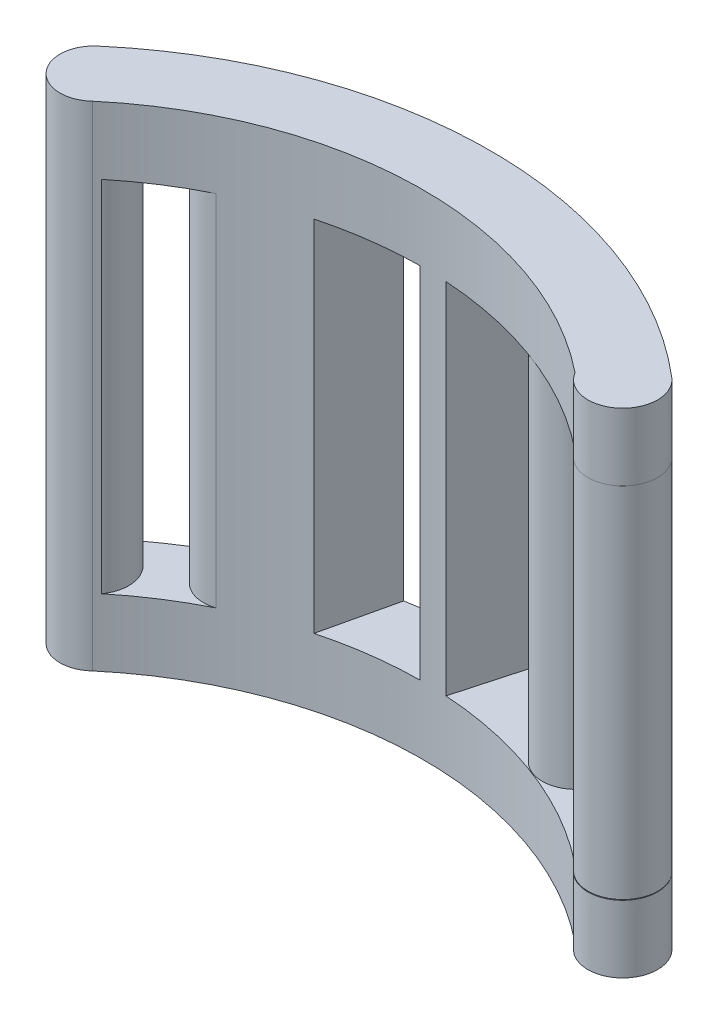
ISO-10303-21;
HEADER;
FILE_DESCRIPTION(('STEP AP214'),'2;1');
FILE_NAME('part.step','',(''),(''),'','','');
FILE_SCHEMA(('AUTOMOTIVE_DESIGN { 1 0 10303 214 1 1 1 1 }'));
ENDSEC;
DATA;
#1=APPLICATION_CONTEXT('core data for automotive mechanical design processes');
#2=APPLICATION_PROTOCOL_DEFINITION('international standard','automotive_design',2000,#1);
#3=PRODUCT_CONTEXT('',#1,'mechanical');
#4=PRODUCT('Part','Part','',(#3));
#5=PRODUCT_RELATED_PRODUCT_CATEGORY('part','',(#4));
#6=PRODUCT_DEFINITION_FORMATION('','',#4);
#7=PRODUCT_DEFINITION_CONTEXT('part definition',#1,'design');
#8=PRODUCT_DEFINITION('design','',#6,#7);
#9=PRODUCT_DEFINITION_SHAPE('','',#8);
#10=(LENGTH_UNIT() NAMED_UNIT(*) SI_UNIT(.MILLI.,.METRE.));
#11=(NAMED_UNIT(*) PLANE_ANGLE_UNIT() SI_UNIT($,.RADIAN.));
#12=(NAMED_UNIT(*) SI_UNIT($,.STERADIAN.) SOLID_ANGLE_UNIT());
#13=UNCERTAINTY_MEASURE_WITH_UNIT(LENGTH_MEASURE(1.E-05),#10,'distance_accuracy_value','');
#14=(GEOMETRIC_REPRESENTATION_CONTEXT(3) GLOBAL_UNCERTAINTY_ASSIGNED_CONTEXT((#13)) GLOBAL_UNIT_ASSIGNED_CONTEXT((#10,
#11,#12)) REPRESENTATION_CONTEXT('',''));
#15=CARTESIAN_POINT('',(0.,0.,0.));
#16=DIRECTION('',(0.,0.,1.));
#17=DIRECTION('',(1.,0.,0.));
#18=AXIS2_PLACEMENT_3D('',#15,#16,#17);
#19=CARTESIAN_POINT('',(0.,7.5,0.));
#20=DIRECTION('',(0.,1.,0.));
#21=DIRECTION('',(0.,0.,1.));
#22=AXIS2_PLACEMENT_3D('',#19,#20,#21);
#23=PLANE('',#22);
#24=CARTESIAN_POINT('',(0.,7.5,37.5));
#25=DIRECTION('',(0.,1.,0.));
#26=DIRECTION('',(0.,0.,1.));
#27=AXIS2_PLACEMENT_3D('',#24,#25,#26);
#28=CIRCLE('',#27,41.7666594256334);
#29=CARTESIAN_POINT('',(-26.40696401353,7.5,5.14067226957616));
#30=VERTEX_POINT('',#29);
#31=CARTESIAN_POINT('',(-18.6730291575454,7.5,0.139970266897417));
#32=VERTEX_POINT('',#31);
#33=EDGE_CURVE('E306',#30,#32,#28,.F.);
#34=ORIENTED_EDGE('',*,*,#33,.T.);
#35=CARTESIAN_POINT('',(-19.8727473270932,7.5,-3.46567479517633));
#36=DIRECTION('',(0.,1.,0.));
#37=DIRECTION('',(0.,0.,1.));
#38=AXIS2_PLACEMENT_3D('',#35,#36,#37);
#39=CIRCLE('',#38,3.8);
#40=CARTESIAN_POINT('',(-21.989278078504,7.5,-6.62166870808745));
#41=VERTEX_POINT('',#40);
#42=EDGE_CURVE('E50',#41,#32,#39,.T.);
#43=ORIENTED_EDGE('',*,*,#42,.F.);
#44=CARTESIAN_POINT('',(0.,7.5,37.5));
#45=DIRECTION('',(0.,1.,0.));
#46=DIRECTION('',(0.,0.,1.));
#47=AXIS2_PLACEMENT_3D('',#44,#45,#46);
#48=CIRCLE('',#47,49.2975658628294);
#49=CARTESIAN_POINT('',(-31.2499618410222,7.5,-0.62728530769867));
#50=VERTEX_POINT('',#49);
#51=EDGE_CURVE('E305',#41,#50,#48,.T.);
#52=ORIENTED_EDGE('',*,*,#51,.T.);
#53=CARTESIAN_POINT('',(-29.5542605443127,7.5,2.86610092463355));
#54=DIRECTION('',(0.,1.,0.));
#55=DIRECTION('',(0.,0.,1.));
#56=AXIS2_PLACEMENT_3D('',#53,#54,#55);
#57=CIRCLE('',#56,3.88318815613034);
#58=EDGE_CURVE('E291',#30,#50,#57,.T.);
#59=ORIENTED_EDGE('',*,*,#58,.F.);
#60=EDGE_LOOP('',(#34,#43,#52,#59));
#61=FACE_BOUND('',#60,.T.);
#62=ADVANCED_FACE('F35',(#61),#23,.T.);
#63=CARTESIAN_POINT('',(16.9271573052782,7.5,-8.80033850375574));
#64=VERTEX_POINT('',#63);
#65=CARTESIAN_POINT('',(4.68756520055688,7.5,-11.5741961981093));
#66=VERTEX_POINT('',#65);
#67=EDGE_CURVE('E304',#64,#66,#48,.T.);
#68=ORIENTED_EDGE('',*,*,#67,.T.);
#69=DIRECTION('',(0.266201395000134,0.,-0.963917432822948));
#70=VECTOR('',#69,1.);
#71=CARTESIAN_POINT('',(1.38549505067042,7.5,0.382626875181736));
#72=LINE('',#71,#70);
#73=CARTESIAN_POINT('',(2.64629546329016,7.5,-4.18274175120704));
#74=VERTEX_POINT('',#73);
#75=EDGE_CURVE('E250',#74,#66,#72,.T.);
#76=ORIENTED_EDGE('',*,*,#75,.F.);
#77=CARTESIAN_POINT('',(26.1024490898602,7.5,4.89454047114034));
#78=VERTEX_POINT('',#77);
#79=EDGE_CURVE('E303',#74,#78,#28,.F.);
#80=ORIENTED_EDGE('',*,*,#79,.T.);
#81=CARTESIAN_POINT('',(29.4158548914739,7.5,2.86610092463355));
#82=DIRECTION('',(0.,1.,0.));
#83=DIRECTION('',(0.,0.,1.));
#84=AXIS2_PLACEMENT_3D('',#81,#82,#83);
#85=CIRCLE('',#84,3.885);
#86=CARTESIAN_POINT('',(31.5452011255118,7.5,-0.383377435901978));
#87=VERTEX_POINT('',#86);
#88=EDGE_CURVE('E270',#87,#78,#85,.T.);
#89=ORIENTED_EDGE('',*,*,#88,.F.);
#90=CARTESIAN_POINT('',(18.2253454449159,7.5,-8.30487728848844));
#91=VERTEX_POINT('',#90);
#92=EDGE_CURVE('E301',#87,#91,#48,.T.);
#93=ORIENTED_EDGE('',*,*,#92,.T.);
#94=CARTESIAN_POINT('',(16.2531952722175,7.5,-5.08598793091094));
#95=DIRECTION('',(0.,1.,0.));
#96=DIRECTION('',(0.,0.,1.));
#97=AXIS2_PLACEMENT_3D('',#94,#95,#96);
#98=CIRCLE('',#97,3.775);
#99=EDGE_CURVE('E283',#64,#91,#98,.T.);
#100=ORIENTED_EDGE('',*,*,#99,.F.);
#101=EDGE_LOOP('',(#68,#76,#80,#89,#93,#100));
#102=FACE_BOUND('',#101,.T.);
#103=ADVANCED_FACE('F379',(#102),#23,.T.);
#104=CARTESIAN_POINT('',(-4.88200973889097,7.5,-11.5552339807831));
#105=VERTEX_POINT('',#104);
#106=EDGE_CURVE('E396',#66,#105,#48,.T.);
#107=ORIENTED_EDGE('',*,*,#106,.T.);
#108=DIRECTION('',(-0.999998036813001,0.,0.00198150703869986));
#109=VECTOR('',#108,1.);
#110=CARTESIAN_POINT('',(-0.0229159010933731,7.5,-11.5648623283266));
#111=LINE('',#110,#109);
#112=EDGE_CURVE('E253',#66,#105,#111,.T.);
#113=ORIENTED_EDGE('',*,*,#112,.F.);
#114=EDGE_LOOP('',(#107,#113));
#115=FACE_BOUND('',#114,.T.);
#116=ADVANCED_FACE('F381',(#115),#23,.T.);
#117=DIRECTION('',(-0.223333267091073,0.,0.974742146318927));
#118=VECTOR('',#117,1.);
#119=CARTESIAN_POINT('',(-10.8316131328072,7.5,-2.48174305169002));
#120=LINE('',#119,#118);
#121=CARTESIAN_POINT('',(-8.88200973889098,7.5,-10.9908228740062));
#122=VERTEX_POINT('',#121);
#123=CARTESIAN_POINT('',(-10.7447340859425,7.5,-2.86092824749246));
#124=VERTEX_POINT('',#123);
#125=EDGE_CURVE('E242',#122,#124,#120,.T.);
#126=ORIENTED_EDGE('',*,*,#125,.T.);
#127=CARTESIAN_POINT('',(-0.353704536709847,7.5,-4.26516171018088));
#128=VERTEX_POINT('',#127);
#129=EDGE_CURVE('E179',#124,#128,#28,.F.);
#130=ORIENTED_EDGE('',*,*,#129,.T.);
#131=DIRECTION('',(0.527651583228901,0.,0.84946089181082));
#132=VECTOR('',#131,1.);
#133=CARTESIAN_POINT('',(1.65650069028655,7.5,-1.02895285736606));
#134=LINE('',#133,#132);
#135=EDGE_CURVE('E256',#105,#128,#134,.T.);
#136=ORIENTED_EDGE('',*,*,#135,.F.);
#137=EDGE_CURVE('E58',#105,#122,#48,.T.);
#138=ORIENTED_EDGE('',*,*,#137,.T.);
#139=EDGE_LOOP('',(#126,#130,#136,#138));
#140=FACE_BOUND('',#139,.T.);
#141=ADVANCED_FACE('F389',(#140),#23,.T.);
#142=CARTESIAN_POINT('',(29.481417229697,7.5,2.95146418394884));
#143=DIRECTION('',(0.,1.,0.));
#144=DIRECTION('',(0.,0.,1.));
#145=AXIS2_PLACEMENT_3D('',#142,#143,#144);
#146=CIRCLE('',#145,3.88);
#147=CARTESIAN_POINT('',(32.6340084217115,7.5,0.689701867516633));
#148=VERTEX_POINT('',#147);
#149=CARTESIAN_POINT('',(26.4829780281144,7.5,5.41393496639744));
#150=VERTEX_POINT('',#149);
#151=EDGE_CURVE('E308',#148,#150,#146,.F.);
#152=ORIENTED_EDGE('',*,*,#151,.F.);
#153=EDGE_CURVE('E273',#150,#148,#85,.T.);
#154=ORIENTED_EDGE('',*,*,#153,.F.);
#155=EDGE_LOOP('',(#152,#154));
#156=FACE_BOUND('',#155,.T.);
#157=ADVANCED_FACE('F345',(#156),#23,.T.);
#158=CARTESIAN_POINT('',(0.,7.5,37.5));
#159=DIRECTION('',(0.,-1.,0.));
#160=DIRECTION('',(0.,0.,-1.));
#161=AXIS2_PLACEMENT_3D('',#158,#159,#160);
#162=CYLINDRICAL_SURFACE('',#161,49.2975658628294);
#163=DIRECTION('',(0.,-1.,0.));
#164=VECTOR('',#163,1.);
#165=CARTESIAN_POINT('',(-32.,7.5,0.));
#166=LINE('',#165,#164);
#167=CARTESIAN_POINT('',(-32.,55.,0.));
#168=VERTEX_POINT('',#167);
#169=CARTESIAN_POINT('',(-32.,0.,0.));
#170=VERTEX_POINT('',#169);
#171=EDGE_CURVE('E11',#168,#170,#166,.T.);
#172=ORIENTED_EDGE('',*,*,#171,.F.);
#173=CARTESIAN_POINT('',(0.,55.,37.5));
#174=DIRECTION('',(0.,1.,0.));
#175=DIRECTION('',(0.,0.,1.));
#176=AXIS2_PLACEMENT_3D('',#173,#174,#175);
#177=CIRCLE('',#176,49.2975658628294);
#178=CARTESIAN_POINT('',(32.,55.,0.));
#179=VERTEX_POINT('',#178);
#180=EDGE_CURVE('E220',#179,#168,#177,.T.);
#181=ORIENTED_EDGE('',*,*,#180,.F.);
#182=DIRECTION('',(0.,-1.,0.));
#183=VECTOR('',#182,1.);
#184=CARTESIAN_POINT('',(32.,7.5,0.));
#185=LINE('',#184,#183);
#186=CARTESIAN_POINT('',(32.,0.,0.));
#187=VERTEX_POINT('',#186);
#188=EDGE_CURVE('E311',#179,#187,#185,.T.);
#189=ORIENTED_EDGE('',*,*,#188,.T.);
#190=CARTESIAN_POINT('',(0.,0.,37.5));
#191=DIRECTION('',(0.,1.,0.));
#192=DIRECTION('',(0.,0.,1.));
#193=AXIS2_PLACEMENT_3D('',#190,#191,#192);
#194=CIRCLE('',#193,49.2975658628294);
#195=EDGE_CURVE('E300',#187,#170,#194,.T.);
#196=ORIENTED_EDGE('',*,*,#195,.T.);
#197=EDGE_LOOP('',(#172,#181,#189,#196));
#198=FACE_BOUND('',#197,.T.);
#199=DIRECTION('',(0.,-1.,0.));
#200=VECTOR('',#199,1.);
#201=CARTESIAN_POINT('',(16.9271573052782,27.5,-8.80033850375574));
#202=LINE('',#201,#200);
#203=CARTESIAN_POINT('',(16.9271573052782,47.5,-8.80033850375574));
#204=VERTEX_POINT('',#203);
#205=EDGE_CURVE('E289',#204,#64,#202,.T.);
#206=ORIENTED_EDGE('',*,*,#205,.F.);
#207=CARTESIAN_POINT('',(0.,47.5,37.5));
#208=DIRECTION('',(0.,1.,0.));
#209=DIRECTION('',(0.,0.,1.));
#210=AXIS2_PLACEMENT_3D('',#207,#208,#209);
#211=CIRCLE('',#210,49.2975658628294);
#212=CARTESIAN_POINT('',(4.68756520055688,47.5,-11.5741961981093));
#213=VERTEX_POINT('',#212);
#214=EDGE_CURVE('E223',#204,#213,#211,.T.);
#215=ORIENTED_EDGE('',*,*,#214,.T.);
#216=CARTESIAN_POINT('',(-4.88200973889097,47.5,-11.5552339807831));
#217=VERTEX_POINT('',#216);
#218=EDGE_CURVE('E401',#213,#217,#211,.T.);
#219=ORIENTED_EDGE('',*,*,#218,.T.);
#220=CARTESIAN_POINT('',(-8.88200973889098,47.5,-10.9908228740062));
#221=VERTEX_POINT('',#220);
#222=EDGE_CURVE('E357',#217,#221,#211,.T.);
#223=ORIENTED_EDGE('',*,*,#222,.T.);
#224=DIRECTION('',(0.,-1.,0.));
#225=VECTOR('',#224,1.);
#226=CARTESIAN_POINT('',(-8.88200973889098,27.5,-10.9908228740062));
#227=LINE('',#226,#225);
#228=EDGE_CURVE('E184',#221,#122,#227,.T.);
#229=ORIENTED_EDGE('',*,*,#228,.T.);
#230=ORIENTED_EDGE('',*,*,#137,.F.);
#231=ORIENTED_EDGE('',*,*,#106,.F.);
#232=ORIENTED_EDGE('',*,*,#67,.F.);
#233=EDGE_LOOP('',(#206,#215,#219,#223,#229,#230,#231,#232));
#234=FACE_BOUND('',#233,.T.);
#235=DIRECTION('',(0.,-1.,0.));
#236=VECTOR('',#235,1.);
#237=CARTESIAN_POINT('',(31.5452011255118,27.5,-0.383377435901978));
#238=LINE('',#237,#236);
#239=CARTESIAN_POINT('',(31.5452011255118,47.5,-0.383377435901978));
#240=VERTEX_POINT('',#239);
#241=EDGE_CURVE('E281',#240,#87,#238,.T.);
#242=ORIENTED_EDGE('',*,*,#241,.F.);
#243=CARTESIAN_POINT('',(18.2253454449159,47.5,-8.30487728848844));
#244=VERTEX_POINT('',#243);
#245=EDGE_CURVE('E221',#240,#244,#211,.T.);
#246=ORIENTED_EDGE('',*,*,#245,.T.);
#247=DIRECTION('',(0.,-1.,0.));
#248=VECTOR('',#247,1.);
#249=CARTESIAN_POINT('',(18.2253454449159,27.5,-8.30487728848844));
#250=LINE('',#249,#248);
#251=EDGE_CURVE('E286',#244,#91,#250,.T.);
#252=ORIENTED_EDGE('',*,*,#251,.T.);
#253=ORIENTED_EDGE('',*,*,#92,.F.);
#254=EDGE_LOOP('',(#242,#246,#252,#253));
#255=FACE_BOUND('',#254,.T.);
#256=CARTESIAN_POINT('',(-21.989278078504,47.5,-6.62166870808745));
#257=VERTEX_POINT('',#256);
#258=CARTESIAN_POINT('',(-31.2499618410222,47.5,-0.62728530769867));
#259=VERTEX_POINT('',#258);
#260=EDGE_CURVE('E224',#257,#259,#211,.T.);
#261=ORIENTED_EDGE('',*,*,#260,.T.);
#262=DIRECTION('',(0.,-1.,0.));
#263=VECTOR('',#262,1.);
#264=CARTESIAN_POINT('',(-31.2499618410222,27.5,-0.62728530769867));
#265=LINE('',#264,#263);
#266=EDGE_CURVE('E294',#259,#50,#265,.T.);
#267=ORIENTED_EDGE('',*,*,#266,.T.);
#268=ORIENTED_EDGE('',*,*,#51,.F.);
#269=DIRECTION('',(0.,-1.,0.));
#270=VECTOR('',#269,1.);
#271=CARTESIAN_POINT('',(-21.989278078504,27.5,-6.62166870808745));
#272=LINE('',#271,#270);
#273=EDGE_CURVE('E247',#257,#41,#272,.T.);
#274=ORIENTED_EDGE('',*,*,#273,.F.);
#275=EDGE_LOOP('',(#261,#267,#268,#274));
#276=FACE_BOUND('',#275,.T.);
#277=ADVANCED_FACE('F37',(#198,#234,#255,#276),#162,.T.);
#278=CARTESIAN_POINT('',(-29.5542605443127,7.5,2.86610092463355));
#279=DIRECTION('',(0.,-1.,0.));
#280=DIRECTION('',(0.,0.,-1.));
#281=AXIS2_PLACEMENT_3D('',#278,#279,#280);
#282=CYLINDRICAL_SURFACE('',#281,3.76778130937702);
#283=CARTESIAN_POINT('',(-29.5542605443127,0.,2.86610092463355));
#284=DIRECTION('',(0.,1.,0.));
#285=DIRECTION('',(0.,0.,1.));
#286=AXIS2_PLACEMENT_3D('',#283,#284,#285);
#287=CIRCLE('',#286,3.76778130937702);
#288=CARTESIAN_POINT('',(-26.9748633655122,0.,5.61253246197192));
#289=VERTEX_POINT('',#288);
#290=EDGE_CURVE('E314',#170,#289,#287,.T.);
#291=ORIENTED_EDGE('',*,*,#290,.T.);
#292=DIRECTION('',(0.,-1.,0.));
#293=VECTOR('',#292,1.);
#294=CARTESIAN_POINT('',(-26.9748633655122,7.5,5.61253246197192));
#295=LINE('',#294,#293);
#296=CARTESIAN_POINT('',(-26.9748633655122,55.,5.61253246197192));
#297=VERTEX_POINT('',#296);
#298=EDGE_CURVE('E43',#297,#289,#295,.T.);
#299=ORIENTED_EDGE('',*,*,#298,.F.);
#300=CARTESIAN_POINT('',(-29.5542605443127,55.,2.86610092463355));
#301=DIRECTION('',(0.,1.,0.));
#302=DIRECTION('',(0.,0.,1.));
#303=AXIS2_PLACEMENT_3D('',#300,#301,#302);
#304=CIRCLE('',#303,3.76778130937702);
#305=EDGE_CURVE('E232',#168,#297,#304,.T.);
#306=ORIENTED_EDGE('',*,*,#305,.F.);
#307=ORIENTED_EDGE('',*,*,#171,.T.);
#308=EDGE_LOOP('',(#291,#299,#306,#307));
#309=FACE_BOUND('',#308,.T.);
#310=ADVANCED_FACE('F341',(#309),#282,.T.);
#311=CARTESIAN_POINT('',(0.,7.5,37.5));
#312=DIRECTION('',(0.,-1.,0.));
#313=DIRECTION('',(0.,0.,-1.));
#314=AXIS2_PLACEMENT_3D('',#311,#312,#313);
#315=CYLINDRICAL_SURFACE('',#314,41.7666594256334);
#316=DIRECTION('',(0.,-1.,0.));
#317=VECTOR('',#316,1.);
#318=CARTESIAN_POINT('',(-26.40696401353,27.5,5.14067226957616));
#319=LINE('',#318,#317);
#320=CARTESIAN_POINT('',(-26.40696401353,47.5,5.14067226957616));
#321=VERTEX_POINT('',#320);
#322=EDGE_CURVE('E297',#321,#30,#319,.T.);
#323=ORIENTED_EDGE('',*,*,#322,.F.);
#324=CARTESIAN_POINT('',(0.,47.5,37.5));
#325=DIRECTION('',(0.,1.,0.));
#326=DIRECTION('',(0.,0.,1.));
#327=AXIS2_PLACEMENT_3D('',#324,#325,#326);
#328=CIRCLE('',#327,41.7666594256334);
#329=CARTESIAN_POINT('',(-18.6730291575454,47.5,0.139970266897417));
#330=VERTEX_POINT('',#329);
#331=EDGE_CURVE('E193',#321,#330,#328,.F.);
#332=ORIENTED_EDGE('',*,*,#331,.T.);
#333=DIRECTION('',(0.,-1.,0.));
#334=VECTOR('',#333,1.);
#335=CARTESIAN_POINT('',(-18.6730291575454,27.5,0.139970266897424));
#336=LINE('',#335,#334);
#337=EDGE_CURVE('E183',#330,#32,#336,.T.);
#338=ORIENTED_EDGE('',*,*,#337,.T.);
#339=ORIENTED_EDGE('',*,*,#33,.F.);
#340=EDGE_LOOP('',(#323,#332,#338,#339));
#341=FACE_BOUND('',#340,.T.);
#342=DIRECTION('',(0.,-1.,0.));
#343=VECTOR('',#342,1.);
#344=CARTESIAN_POINT('',(26.1411616670208,7.5,4.92556974749162));
#345=LINE('',#344,#343);
#346=CARTESIAN_POINT('',(26.1411616670208,55.,4.92556974749162));
#347=VERTEX_POINT('',#346);
#348=CARTESIAN_POINT('',(26.1411616670208,0.,4.92556974749162));
#349=VERTEX_POINT('',#348);
#350=EDGE_CURVE('E323',#347,#349,#345,.T.);
#351=ORIENTED_EDGE('',*,*,#350,.F.);
#352=CARTESIAN_POINT('',(0.,55.,37.5));
#353=DIRECTION('',(0.,1.,0.));
#354=DIRECTION('',(0.,0.,1.));
#355=AXIS2_PLACEMENT_3D('',#352,#353,#354);
#356=CIRCLE('',#355,41.7666594256334);
#357=EDGE_CURVE('E235',#297,#347,#356,.F.);
#358=ORIENTED_EDGE('',*,*,#357,.F.);
#359=ORIENTED_EDGE('',*,*,#298,.T.);
#360=CARTESIAN_POINT('',(0.,0.,37.5));
#361=DIRECTION('',(0.,1.,0.));
#362=DIRECTION('',(0.,0.,1.));
#363=AXIS2_PLACEMENT_3D('',#360,#361,#362);
#364=CIRCLE('',#363,41.7666594256334);
#365=EDGE_CURVE('E316',#289,#349,#364,.F.);
#366=ORIENTED_EDGE('',*,*,#365,.T.);
#367=EDGE_LOOP('',(#351,#358,#359,#366));
#368=FACE_BOUND('',#367,.T.);
#369=DIRECTION('',(0.,-1.,0.));
#370=VECTOR('',#369,1.);
#371=CARTESIAN_POINT('',(2.64629546329016,27.5,-4.18274175120704));
#372=LINE('',#371,#370);
#373=CARTESIAN_POINT('',(2.64629546329016,47.5,-4.18274175120704));
#374=VERTEX_POINT('',#373);
#375=EDGE_CURVE('E259',#374,#74,#372,.T.);
#376=ORIENTED_EDGE('',*,*,#375,.F.);
#377=CARTESIAN_POINT('',(26.1024490898602,47.5,4.89454047114034));
#378=VERTEX_POINT('',#377);
#379=EDGE_CURVE('E194',#374,#378,#328,.F.);
#380=ORIENTED_EDGE('',*,*,#379,.T.);
#381=DIRECTION('',(0.,-1.,0.));
#382=VECTOR('',#381,1.);
#383=CARTESIAN_POINT('',(26.1024490898602,27.5,4.89454047114034));
#384=LINE('',#383,#382);
#385=EDGE_CURVE('E278',#378,#78,#384,.T.);
#386=ORIENTED_EDGE('',*,*,#385,.T.);
#387=ORIENTED_EDGE('',*,*,#79,.F.);
#388=EDGE_LOOP('',(#376,#380,#386,#387));
#389=FACE_BOUND('',#388,.T.);
#390=CARTESIAN_POINT('',(-10.7447340859425,47.5,-2.86092824749246));
#391=VERTEX_POINT('',#390);
#392=CARTESIAN_POINT('',(-0.353704536709847,47.5,-4.26516171018088));
#393=VERTEX_POINT('',#392);
#394=EDGE_CURVE('E177',#391,#393,#328,.F.);
#395=ORIENTED_EDGE('',*,*,#394,.T.);
#396=DIRECTION('',(0.,-1.,0.));
#397=VECTOR('',#396,1.);
#398=CARTESIAN_POINT('',(-0.353704536709847,27.5,-4.26516171018088));
#399=LINE('',#398,#397);
#400=EDGE_CURVE('E262',#393,#128,#399,.T.);
#401=ORIENTED_EDGE('',*,*,#400,.T.);
#402=ORIENTED_EDGE('',*,*,#129,.F.);
#403=DIRECTION('',(0.,-1.,0.));
#404=VECTOR('',#403,1.);
#405=CARTESIAN_POINT('',(-10.7447340859425,27.5,-2.86092824749246));
#406=LINE('',#405,#404);
#407=EDGE_CURVE('E173',#391,#124,#406,.T.);
#408=ORIENTED_EDGE('',*,*,#407,.F.);
#409=EDGE_LOOP('',(#395,#401,#402,#408));
#410=FACE_BOUND('',#409,.T.);
#411=ADVANCED_FACE('F175',(#341,#368,#389,#410),#315,.F.);
#412=CARTESIAN_POINT('',(29.481417229697,7.5,2.95146418394884));
#413=DIRECTION('',(0.,-1.,0.));
#414=DIRECTION('',(0.,0.,-1.));
#415=AXIS2_PLACEMENT_3D('',#412,#413,#414);
#416=CYLINDRICAL_SURFACE('',#415,3.88);
#417=DIRECTION('',(0.,-1.,0.));
#418=VECTOR('',#417,1.);
#419=CARTESIAN_POINT('',(26.4829780281144,27.5,5.41393496639744));
#420=LINE('',#419,#418);
#421=CARTESIAN_POINT('',(26.4829780281144,47.5,5.41393496639744));
#422=VERTEX_POINT('',#421);
#423=EDGE_CURVE('E276',#422,#150,#420,.T.);
#424=ORIENTED_EDGE('',*,*,#423,.F.);
#425=CARTESIAN_POINT('',(29.481417229697,47.5,2.95146418394884));
#426=DIRECTION('',(0.,1.,0.));
#427=DIRECTION('',(0.,0.,1.));
#428=AXIS2_PLACEMENT_3D('',#425,#426,#427);
#429=CIRCLE('',#428,3.88);
#430=CARTESIAN_POINT('',(32.6340084217115,47.5,0.689701867516633));
#431=VERTEX_POINT('',#430);
#432=EDGE_CURVE('E227',#431,#422,#429,.F.);
#433=ORIENTED_EDGE('',*,*,#432,.F.);
#434=DIRECTION('',(0.,-1.,0.));
#435=VECTOR('',#434,1.);
#436=CARTESIAN_POINT('',(32.6340084217115,27.5,0.689701867516635));
#437=LINE('',#436,#435);
#438=EDGE_CURVE('E274',#431,#148,#437,.T.);
#439=ORIENTED_EDGE('',*,*,#438,.T.);
#440=ORIENTED_EDGE('',*,*,#151,.T.);
#441=EDGE_LOOP('',(#424,#433,#439,#440));
#442=FACE_BOUND('',#441,.T.);
#443=CARTESIAN_POINT('',(29.481417229697,0.,2.95146418394884));
#444=DIRECTION('',(0.,1.,0.));
#445=DIRECTION('',(0.,0.,1.));
#446=AXIS2_PLACEMENT_3D('',#443,#444,#445);
#447=CIRCLE('',#446,3.88);
#448=EDGE_CURVE('E319',#187,#349,#447,.F.);
#449=ORIENTED_EDGE('',*,*,#448,.F.);
#450=ORIENTED_EDGE('',*,*,#188,.F.);
#451=CARTESIAN_POINT('',(29.481417229697,55.,2.95146418394884));
#452=DIRECTION('',(0.,1.,0.));
#453=DIRECTION('',(0.,0.,1.));
#454=AXIS2_PLACEMENT_3D('',#451,#452,#453);
#455=CIRCLE('',#454,3.88);
#456=EDGE_CURVE('E238',#179,#347,#455,.F.);
#457=ORIENTED_EDGE('',*,*,#456,.T.);
#458=ORIENTED_EDGE('',*,*,#350,.T.);
#459=EDGE_LOOP('',(#449,#450,#457,#458));
#460=FACE_BOUND('',#459,.T.);
#461=ADVANCED_FACE('F336',(#442,#460),#416,.T.);
#462=CARTESIAN_POINT('',(0.,0.,0.));
#463=DIRECTION('',(0.,1.,0.));
#464=DIRECTION('',(0.,0.,1.));
#465=AXIS2_PLACEMENT_3D('',#462,#463,#464);
#466=PLANE('',#465);
#467=ORIENTED_EDGE('',*,*,#195,.F.);
#468=ORIENTED_EDGE('',*,*,#448,.T.);
#469=ORIENTED_EDGE('',*,*,#365,.F.);
#470=ORIENTED_EDGE('',*,*,#290,.F.);
#471=EDGE_LOOP('',(#467,#468,#469,#470));
#472=FACE_BOUND('',#471,.T.);
#473=ADVANCED_FACE('F333',(#472),#466,.F.);
#474=CARTESIAN_POINT('',(-29.5542605443127,27.5,2.86610092463355));
#475=DIRECTION('',(0.,-1.,0.));
#476=DIRECTION('',(0.,0.,-1.));
#477=AXIS2_PLACEMENT_3D('',#474,#475,#476);
#478=CYLINDRICAL_SURFACE('',#477,3.88318815613034);
#479=ORIENTED_EDGE('',*,*,#58,.T.);
#480=ORIENTED_EDGE('',*,*,#266,.F.);
#481=CARTESIAN_POINT('',(-29.5542605443127,47.5,2.86610092463355));
#482=DIRECTION('',(0.,1.,0.));
#483=DIRECTION('',(0.,0.,1.));
#484=AXIS2_PLACEMENT_3D('',#481,#482,#483);
#485=CIRCLE('',#484,3.88318815613034);
#486=EDGE_CURVE('E217',#321,#259,#485,.T.);
#487=ORIENTED_EDGE('',*,*,#486,.F.);
#488=ORIENTED_EDGE('',*,*,#322,.T.);
#489=EDGE_LOOP('',(#479,#480,#487,#488));
#490=FACE_BOUND('',#489,.T.);
#491=ADVANCED_FACE('F362',(#490),#478,.T.);
#492=CARTESIAN_POINT('',(16.2531952722175,27.5,-5.08598793091094));
#493=DIRECTION('',(0.,-1.,0.));
#494=DIRECTION('',(0.,0.,-1.));
#495=AXIS2_PLACEMENT_3D('',#492,#493,#494);
#496=CYLINDRICAL_SURFACE('',#495,3.775);
#497=ORIENTED_EDGE('',*,*,#99,.T.);
#498=ORIENTED_EDGE('',*,*,#251,.F.);
#499=CARTESIAN_POINT('',(16.2531952722175,47.5,-5.08598793091094));
#500=DIRECTION('',(0.,1.,0.));
#501=DIRECTION('',(0.,0.,1.));
#502=AXIS2_PLACEMENT_3D('',#499,#500,#501);
#503=CIRCLE('',#502,3.775);
#504=EDGE_CURVE('E214',#204,#244,#503,.T.);
#505=ORIENTED_EDGE('',*,*,#504,.F.);
#506=ORIENTED_EDGE('',*,*,#205,.T.);
#507=EDGE_LOOP('',(#497,#498,#505,#506));
#508=FACE_BOUND('',#507,.T.);
#509=ADVANCED_FACE('F418',(#508),#496,.T.);
#510=CARTESIAN_POINT('',(29.4158548914739,27.5,2.86610092463355));
#511=DIRECTION('',(0.,-1.,0.));
#512=DIRECTION('',(0.,0.,-1.));
#513=AXIS2_PLACEMENT_3D('',#510,#511,#512);
#514=CYLINDRICAL_SURFACE('',#513,3.885);
#515=ORIENTED_EDGE('',*,*,#88,.T.);
#516=ORIENTED_EDGE('',*,*,#385,.F.);
#517=CARTESIAN_POINT('',(29.4158548914739,47.5,2.86610092463355));
#518=DIRECTION('',(0.,1.,0.));
#519=DIRECTION('',(0.,0.,1.));
#520=AXIS2_PLACEMENT_3D('',#517,#518,#519);
#521=CIRCLE('',#520,3.885);
#522=EDGE_CURVE('E210',#240,#378,#521,.T.);
#523=ORIENTED_EDGE('',*,*,#522,.F.);
#524=ORIENTED_EDGE('',*,*,#241,.T.);
#525=EDGE_LOOP('',(#515,#516,#523,#524));
#526=FACE_BOUND('',#525,.T.);
#527=ADVANCED_FACE('F420',(#526),#514,.T.);
#528=ORIENTED_EDGE('',*,*,#153,.T.);
#529=ORIENTED_EDGE('',*,*,#438,.F.);
#530=EDGE_CURVE('E213',#422,#431,#521,.T.);
#531=ORIENTED_EDGE('',*,*,#530,.F.);
#532=ORIENTED_EDGE('',*,*,#423,.T.);
#533=EDGE_LOOP('',(#528,#529,#531,#532));
#534=FACE_BOUND('',#533,.T.);
#535=ADVANCED_FACE('F438',(#534),#514,.T.);
#536=CARTESIAN_POINT('',(1.38549505067042,27.5,0.382626875181736));
#537=DIRECTION('',(-0.963917432822948,0.,-0.266201395000134));
#538=DIRECTION('',(-0.266201395000134,0.,0.963917432822948));
#539=AXIS2_PLACEMENT_3D('',#536,#537,#538);
#540=PLANE('',#539);
#541=ORIENTED_EDGE('',*,*,#75,.T.);
#542=DIRECTION('',(0.,-1.,0.));
#543=VECTOR('',#542,1.);
#544=CARTESIAN_POINT('',(4.6875652005569,27.5,-11.5741961981093));
#545=LINE('',#544,#543);
#546=EDGE_CURVE('E267',#213,#66,#545,.T.);
#547=ORIENTED_EDGE('',*,*,#546,.F.);
#548=DIRECTION('',(0.266201395000134,0.,-0.963917432822948));
#549=VECTOR('',#548,1.);
#550=CARTESIAN_POINT('',(1.38549505067042,47.5,0.382626875181736));
#551=LINE('',#550,#549);
#552=EDGE_CURVE('E198',#374,#213,#551,.T.);
#553=ORIENTED_EDGE('',*,*,#552,.F.);
#554=ORIENTED_EDGE('',*,*,#375,.T.);
#555=EDGE_LOOP('',(#541,#547,#553,#554));
#556=FACE_BOUND('',#555,.T.);
#557=ADVANCED_FACE('F413',(#556),#540,.F.);
#558=CARTESIAN_POINT('',(-0.0229159010933731,27.5,-11.5648623283266));
#559=DIRECTION('',(0.00198150703869986,0.,0.999998036813001));
#560=DIRECTION('',(0.999998036813001,0.,-0.00198150703869986));
#561=AXIS2_PLACEMENT_3D('',#558,#559,#560);
#562=PLANE('',#561);
#563=ORIENTED_EDGE('',*,*,#112,.T.);
#564=DIRECTION('',(0.,-1.,0.));
#565=VECTOR('',#564,1.);
#566=CARTESIAN_POINT('',(-4.88200973889097,27.5,-11.5552339807831));
#567=LINE('',#566,#565);
#568=EDGE_CURVE('E264',#217,#105,#567,.T.);
#569=ORIENTED_EDGE('',*,*,#568,.F.);
#570=DIRECTION('',(-0.999998036813001,0.,0.00198150703869986));
#571=VECTOR('',#570,1.);
#572=CARTESIAN_POINT('',(-0.0229159010933731,47.5,-11.5648623283266));
#573=LINE('',#572,#571);
#574=EDGE_CURVE('E202',#213,#217,#573,.T.);
#575=ORIENTED_EDGE('',*,*,#574,.F.);
#576=ORIENTED_EDGE('',*,*,#546,.T.);
#577=EDGE_LOOP('',(#563,#569,#575,#576));
#578=FACE_BOUND('',#577,.T.);
#579=ADVANCED_FACE('F375',(#578),#562,.F.);
#580=CARTESIAN_POINT('',(1.65650069028655,27.5,-1.02895285736606));
#581=DIRECTION('',(0.84946089181082,0.,-0.527651583228901));
#582=DIRECTION('',(-0.527651583228901,0.,-0.84946089181082));
#583=AXIS2_PLACEMENT_3D('',#580,#581,#582);
#584=PLANE('',#583);
#585=ORIENTED_EDGE('',*,*,#135,.T.);
#586=ORIENTED_EDGE('',*,*,#400,.F.);
#587=DIRECTION('',(0.527651583228901,0.,0.84946089181082));
#588=VECTOR('',#587,1.);
#589=CARTESIAN_POINT('',(1.65650069028655,47.5,-1.02895285736606));
#590=LINE('',#589,#588);
#591=EDGE_CURVE('E192',#217,#393,#590,.T.);
#592=ORIENTED_EDGE('',*,*,#591,.F.);
#593=ORIENTED_EDGE('',*,*,#568,.T.);
#594=EDGE_LOOP('',(#585,#586,#592,#593));
#595=FACE_BOUND('',#594,.T.);
#596=ADVANCED_FACE('F368',(#595),#584,.F.);
#597=CARTESIAN_POINT('',(-19.8727473270932,27.5,-3.46567479517633));
#598=DIRECTION('',(0.,-1.,0.));
#599=DIRECTION('',(0.,0.,-1.));
#600=AXIS2_PLACEMENT_3D('',#597,#598,#599);
#601=CYLINDRICAL_SURFACE('',#600,3.8);
#602=ORIENTED_EDGE('',*,*,#42,.T.);
#603=ORIENTED_EDGE('',*,*,#337,.F.);
#604=CARTESIAN_POINT('',(-19.8727473270932,47.5,-3.46567479517633));
#605=DIRECTION('',(0.,1.,0.));
#606=DIRECTION('',(0.,0.,1.));
#607=AXIS2_PLACEMENT_3D('',#604,#605,#606);
#608=CIRCLE('',#607,3.8);
#609=EDGE_CURVE('E199',#257,#330,#608,.T.);
#610=ORIENTED_EDGE('',*,*,#609,.F.);
#611=ORIENTED_EDGE('',*,*,#273,.T.);
#612=EDGE_LOOP('',(#602,#603,#610,#611));
#613=FACE_BOUND('',#612,.T.);
#614=ADVANCED_FACE('F366',(#613),#601,.T.);
#615=CARTESIAN_POINT('',(-10.8316131328072,27.5,-2.48174305169002));
#616=DIRECTION('',(0.974742146318927,0.,0.223333267091073));
#617=DIRECTION('',(0.223333267091073,0.,-0.974742146318927));
#618=AXIS2_PLACEMENT_3D('',#615,#616,#617);
#619=PLANE('',#618);
#620=ORIENTED_EDGE('',*,*,#125,.F.);
#621=ORIENTED_EDGE('',*,*,#228,.F.);
#622=DIRECTION('',(-0.223333267091073,0.,0.974742146318927));
#623=VECTOR('',#622,1.);
#624=CARTESIAN_POINT('',(-10.8316131328072,47.5,-2.48174305169002));
#625=LINE('',#624,#623);
#626=EDGE_CURVE('E190',#221,#391,#625,.T.);
#627=ORIENTED_EDGE('',*,*,#626,.T.);
#628=ORIENTED_EDGE('',*,*,#407,.T.);
#629=EDGE_LOOP('',(#620,#621,#627,#628));
#630=FACE_BOUND('',#629,.T.);
#631=ADVANCED_FACE('F196',(#630),#619,.T.);
#632=CARTESIAN_POINT('',(0.,47.5,0.));
#633=DIRECTION('',(0.,-1.,0.));
#634=DIRECTION('',(0.,0.,1.));
#635=AXIS2_PLACEMENT_3D('',#632,#633,#634);
#636=PLANE('',#635);
#637=ORIENTED_EDGE('',*,*,#331,.F.);
#638=ORIENTED_EDGE('',*,*,#486,.T.);
#639=ORIENTED_EDGE('',*,*,#260,.F.);
#640=ORIENTED_EDGE('',*,*,#609,.T.);
#641=EDGE_LOOP('',(#637,#638,#639,#640));
#642=FACE_BOUND('',#641,.T.);
#643=ADVANCED_FACE('F360',(#642),#636,.T.);
#644=ORIENTED_EDGE('',*,*,#214,.F.);
#645=ORIENTED_EDGE('',*,*,#504,.T.);
#646=ORIENTED_EDGE('',*,*,#245,.F.);
#647=ORIENTED_EDGE('',*,*,#522,.T.);
#648=ORIENTED_EDGE('',*,*,#379,.F.);
#649=ORIENTED_EDGE('',*,*,#552,.T.);
#650=EDGE_LOOP('',(#644,#645,#646,#647,#648,#649));
#651=FACE_BOUND('',#650,.T.);
#652=ADVANCED_FACE('F407',(#651),#636,.T.);
#653=ORIENTED_EDGE('',*,*,#218,.F.);
#654=ORIENTED_EDGE('',*,*,#574,.T.);
#655=EDGE_LOOP('',(#653,#654));
#656=FACE_BOUND('',#655,.T.);
#657=ADVANCED_FACE('F404',(#656),#636,.T.);
#658=ORIENTED_EDGE('',*,*,#626,.F.);
#659=ORIENTED_EDGE('',*,*,#222,.F.);
#660=ORIENTED_EDGE('',*,*,#591,.T.);
#661=ORIENTED_EDGE('',*,*,#394,.F.);
#662=EDGE_LOOP('',(#658,#659,#660,#661));
#663=FACE_BOUND('',#662,.T.);
#664=ADVANCED_FACE('F188',(#663),#636,.T.);
#665=ORIENTED_EDGE('',*,*,#432,.T.);
#666=ORIENTED_EDGE('',*,*,#530,.T.);
#667=EDGE_LOOP('',(#665,#666));
#668=FACE_BOUND('',#667,.T.);
#669=ADVANCED_FACE('F483',(#668),#636,.T.);
#670=CARTESIAN_POINT('',(0.,55.,0.));
#671=DIRECTION('',(0.,-1.,0.));
#672=DIRECTION('',(0.,0.,1.));
#673=AXIS2_PLACEMENT_3D('',#670,#671,#672);
#674=PLANE('',#673);
#675=ORIENTED_EDGE('',*,*,#180,.T.);
#676=ORIENTED_EDGE('',*,*,#305,.T.);
#677=ORIENTED_EDGE('',*,*,#357,.T.);
#678=ORIENTED_EDGE('',*,*,#456,.F.);
#679=EDGE_LOOP('',(#675,#676,#677,#678));
#680=FACE_BOUND('',#679,.T.);
#681=ADVANCED_FACE('F340',(#680),#674,.F.);
#682=CLOSED_SHELL('',(#62,#103,#116,#141,#157,#277,#310,#411,#461,#473,#491,#509,#527,#535,#557,
#579,#596,#614,#631,#643,#652,#657,#664,#669,#681));
#683=MANIFOLD_SOLID_BREP('B2',#682);
#684=ADVANCED_BREP_SHAPE_REPRESENTATION('',(#18,#683),#14);
#685=SHAPE_DEFINITION_REPRESENTATION(#9,#684);
ENDSEC;
END-ISO-10303-21;
